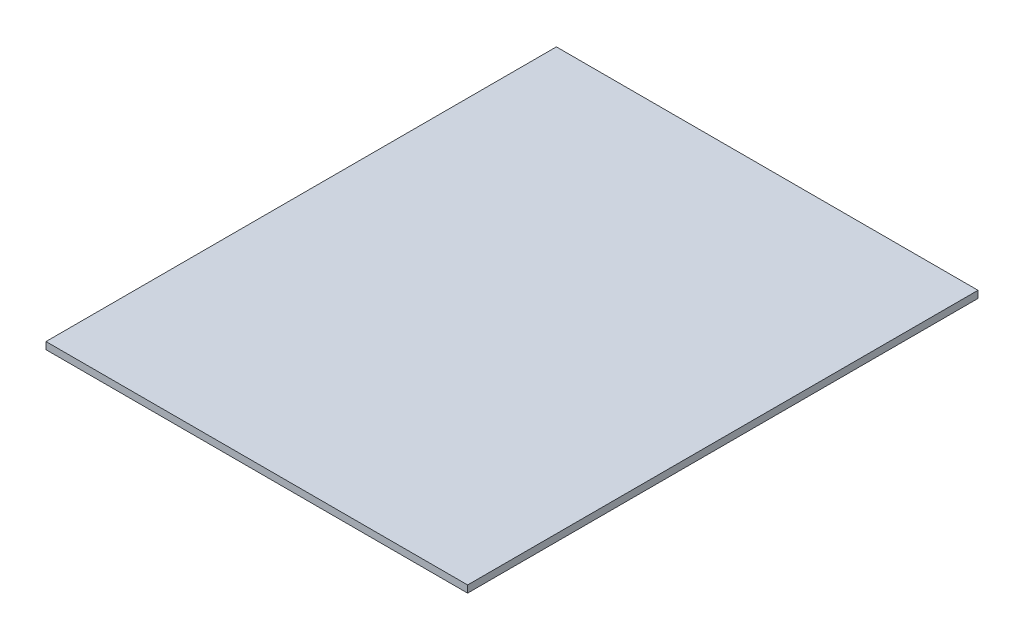
ISO-10303-21;
HEADER;
FILE_DESCRIPTION(('STEP AP214'),'2;1');
FILE_NAME('part.step','',(''),(''),'','','');
FILE_SCHEMA(('AUTOMOTIVE_DESIGN { 1 0 10303 214 1 1 1 1 }'));
ENDSEC;
DATA;
#1=APPLICATION_CONTEXT('core data for automotive mechanical design processes');
#2=APPLICATION_PROTOCOL_DEFINITION('international standard','automotive_design',2000,#1);
#3=PRODUCT_CONTEXT('',#1,'mechanical');
#4=PRODUCT('Part','Part','',(#3));
#5=PRODUCT_RELATED_PRODUCT_CATEGORY('part','',(#4));
#6=PRODUCT_DEFINITION_FORMATION('','',#4);
#7=PRODUCT_DEFINITION_CONTEXT('part definition',#1,'design');
#8=PRODUCT_DEFINITION('design','',#6,#7);
#9=PRODUCT_DEFINITION_SHAPE('','',#8);
#10=(LENGTH_UNIT() NAMED_UNIT(*) SI_UNIT(.MILLI.,.METRE.));
#11=(NAMED_UNIT(*) PLANE_ANGLE_UNIT() SI_UNIT($,.RADIAN.));
#12=(NAMED_UNIT(*) SI_UNIT($,.STERADIAN.) SOLID_ANGLE_UNIT());
#13=UNCERTAINTY_MEASURE_WITH_UNIT(LENGTH_MEASURE(1.E-05),#10,'distance_accuracy_value','');
#14=(GEOMETRIC_REPRESENTATION_CONTEXT(3) GLOBAL_UNCERTAINTY_ASSIGNED_CONTEXT((#13)) GLOBAL_UNIT_ASSIGNED_CONTEXT((#10,
#11,#12)) REPRESENTATION_CONTEXT('',''));
#15=CARTESIAN_POINT('',(0.,0.,0.));
#16=DIRECTION('',(0.,0.,1.));
#17=DIRECTION('',(1.,0.,0.));
#18=AXIS2_PLACEMENT_3D('',#15,#16,#17);
#19=CARTESIAN_POINT('',(0.,1.6,0.));
#20=DIRECTION('',(1.,0.,0.));
#21=DIRECTION('',(0.,0.,-1.));
#22=AXIS2_PLACEMENT_3D('',#19,#20,#21);
#23=PLANE('',#22);
#24=DIRECTION('',(0.,0.,1.));
#25=VECTOR('',#24,1.);
#26=CARTESIAN_POINT('',(0.,0.,0.));
#27=LINE('',#26,#25);
#28=CARTESIAN_POINT('',(0.,0.,-115.));
#29=VERTEX_POINT('',#28);
#30=CARTESIAN_POINT('',(0.,0.,0.));
#31=VERTEX_POINT('',#30);
#32=EDGE_CURVE('E101',#29,#31,#27,.T.);
#33=ORIENTED_EDGE('',*,*,#32,.T.);
#34=DIRECTION('',(0.,-1.,0.));
#35=VECTOR('',#34,1.);
#36=CARTESIAN_POINT('',(0.,1.6,0.));
#37=LINE('',#36,#35);
#38=CARTESIAN_POINT('',(0.,1.6,0.));
#39=VERTEX_POINT('',#38);
#40=EDGE_CURVE('E11',#39,#31,#37,.T.);
#41=ORIENTED_EDGE('',*,*,#40,.F.);
#42=DIRECTION('',(0.,0.,1.));
#43=VECTOR('',#42,1.);
#44=CARTESIAN_POINT('',(0.,1.6,0.));
#45=LINE('',#44,#43);
#46=CARTESIAN_POINT('',(0.,1.6,-115.));
#47=VERTEX_POINT('',#46);
#48=EDGE_CURVE('E95',#47,#39,#45,.T.);
#49=ORIENTED_EDGE('',*,*,#48,.F.);
#50=DIRECTION('',(0.,-1.,0.));
#51=VECTOR('',#50,1.);
#52=CARTESIAN_POINT('',(0.,1.6,-115.));
#53=LINE('',#52,#51);
#54=EDGE_CURVE('E99',#47,#29,#53,.T.);
#55=ORIENTED_EDGE('',*,*,#54,.T.);
#56=EDGE_LOOP('',(#33,#41,#49,#55));
#57=FACE_BOUND('',#56,.T.);
#58=ADVANCED_FACE('F41',(#57),#23,.F.);
#59=CARTESIAN_POINT('',(0.,1.6,0.));
#60=DIRECTION('',(0.,0.,-1.));
#61=DIRECTION('',(-1.,0.,0.));
#62=AXIS2_PLACEMENT_3D('',#59,#60,#61);
#63=PLANE('',#62);
#64=DIRECTION('',(1.,0.,0.));
#65=VECTOR('',#64,1.);
#66=CARTESIAN_POINT('',(0.,0.,0.));
#67=LINE('',#66,#65);
#68=CARTESIAN_POINT('',(95.,0.,0.));
#69=VERTEX_POINT('',#68);
#70=EDGE_CURVE('E96',#31,#69,#67,.T.);
#71=ORIENTED_EDGE('',*,*,#70,.T.);
#72=DIRECTION('',(0.,-1.,0.));
#73=VECTOR('',#72,1.);
#74=CARTESIAN_POINT('',(95.,1.6,0.));
#75=LINE('',#74,#73);
#76=CARTESIAN_POINT('',(95.,1.6,0.));
#77=VERTEX_POINT('',#76);
#78=EDGE_CURVE('E47',#77,#69,#75,.T.);
#79=ORIENTED_EDGE('',*,*,#78,.F.);
#80=DIRECTION('',(1.,0.,0.));
#81=VECTOR('',#80,1.);
#82=CARTESIAN_POINT('',(0.,1.6,0.));
#83=LINE('',#82,#81);
#84=EDGE_CURVE('E90',#39,#77,#83,.T.);
#85=ORIENTED_EDGE('',*,*,#84,.F.);
#86=ORIENTED_EDGE('',*,*,#40,.T.);
#87=EDGE_LOOP('',(#71,#79,#85,#86));
#88=FACE_BOUND('',#87,.T.);
#89=ADVANCED_FACE('F94',(#88),#63,.F.);
#90=CARTESIAN_POINT('',(95.,1.6,0.));
#91=DIRECTION('',(-1.,0.,0.));
#92=DIRECTION('',(0.,0.,1.));
#93=AXIS2_PLACEMENT_3D('',#90,#91,#92);
#94=PLANE('',#93);
#95=DIRECTION('',(0.,0.,-1.));
#96=VECTOR('',#95,1.);
#97=CARTESIAN_POINT('',(95.,0.,0.));
#98=LINE('',#97,#96);
#99=CARTESIAN_POINT('',(95.,0.,-115.));
#100=VERTEX_POINT('',#99);
#101=EDGE_CURVE('E71',#69,#100,#98,.T.);
#102=ORIENTED_EDGE('',*,*,#101,.T.);
#103=DIRECTION('',(0.,-1.,0.));
#104=VECTOR('',#103,1.);
#105=CARTESIAN_POINT('',(95.,1.6,-115.));
#106=LINE('',#105,#104);
#107=CARTESIAN_POINT('',(95.,1.6,-115.));
#108=VERTEX_POINT('',#107);
#109=EDGE_CURVE('E100',#108,#100,#106,.T.);
#110=ORIENTED_EDGE('',*,*,#109,.F.);
#111=DIRECTION('',(0.,0.,-1.));
#112=VECTOR('',#111,1.);
#113=CARTESIAN_POINT('',(95.,1.6,0.));
#114=LINE('',#113,#112);
#115=EDGE_CURVE('E89',#77,#108,#114,.T.);
#116=ORIENTED_EDGE('',*,*,#115,.F.);
#117=ORIENTED_EDGE('',*,*,#78,.T.);
#118=EDGE_LOOP('',(#102,#110,#116,#117));
#119=FACE_BOUND('',#118,.T.);
#120=ADVANCED_FACE('F97',(#119),#94,.F.);
#121=CARTESIAN_POINT('',(0.,1.6,-115.));
#122=DIRECTION('',(0.,0.,1.));
#123=DIRECTION('',(1.,0.,0.));
#124=AXIS2_PLACEMENT_3D('',#121,#122,#123);
#125=PLANE('',#124);
#126=DIRECTION('',(-1.,0.,0.));
#127=VECTOR('',#126,1.);
#128=CARTESIAN_POINT('',(0.,0.,-115.));
#129=LINE('',#128,#127);
#130=EDGE_CURVE('E79',#100,#29,#129,.T.);
#131=ORIENTED_EDGE('',*,*,#130,.T.);
#132=ORIENTED_EDGE('',*,*,#54,.F.);
#133=DIRECTION('',(-1.,0.,0.));
#134=VECTOR('',#133,1.);
#135=CARTESIAN_POINT('',(0.,1.6,-115.));
#136=LINE('',#135,#134);
#137=EDGE_CURVE('E60',#108,#47,#136,.T.);
#138=ORIENTED_EDGE('',*,*,#137,.F.);
#139=ORIENTED_EDGE('',*,*,#109,.T.);
#140=EDGE_LOOP('',(#131,#132,#138,#139));
#141=FACE_BOUND('',#140,.T.);
#142=ADVANCED_FACE('F112',(#141),#125,.F.);
#143=CARTESIAN_POINT('',(0.,1.6,0.));
#144=DIRECTION('',(0.,-1.,0.));
#145=DIRECTION('',(0.,0.,-1.));
#146=AXIS2_PLACEMENT_3D('',#143,#144,#145);
#147=PLANE('',#146);
#148=ORIENTED_EDGE('',*,*,#48,.T.);
#149=ORIENTED_EDGE('',*,*,#84,.T.);
#150=ORIENTED_EDGE('',*,*,#115,.T.);
#151=ORIENTED_EDGE('',*,*,#137,.T.);
#152=EDGE_LOOP('',(#148,#149,#150,#151));
#153=FACE_BOUND('',#152,.T.);
#154=ADVANCED_FACE('F88',(#153),#147,.F.);
#155=CARTESIAN_POINT('',(0.,0.,0.));
#156=DIRECTION('',(0.,-1.,0.));
#157=DIRECTION('',(0.,0.,-1.));
#158=AXIS2_PLACEMENT_3D('',#155,#156,#157);
#159=PLANE('',#158);
#160=ORIENTED_EDGE('',*,*,#32,.F.);
#161=ORIENTED_EDGE('',*,*,#130,.F.);
#162=ORIENTED_EDGE('',*,*,#101,.F.);
#163=ORIENTED_EDGE('',*,*,#70,.F.);
#164=EDGE_LOOP('',(#160,#161,#162,#163));
#165=FACE_BOUND('',#164,.T.);
#166=ADVANCED_FACE('F114',(#165),#159,.T.);
#167=CLOSED_SHELL('',(#58,#89,#120,#142,#154,#166));
#168=MANIFOLD_SOLID_BREP('B2',#167);
#169=ADVANCED_BREP_SHAPE_REPRESENTATION('',(#18,#168),#14);
#170=SHAPE_DEFINITION_REPRESENTATION(#9,#169);
ENDSEC;
END-ISO-10303-21;
